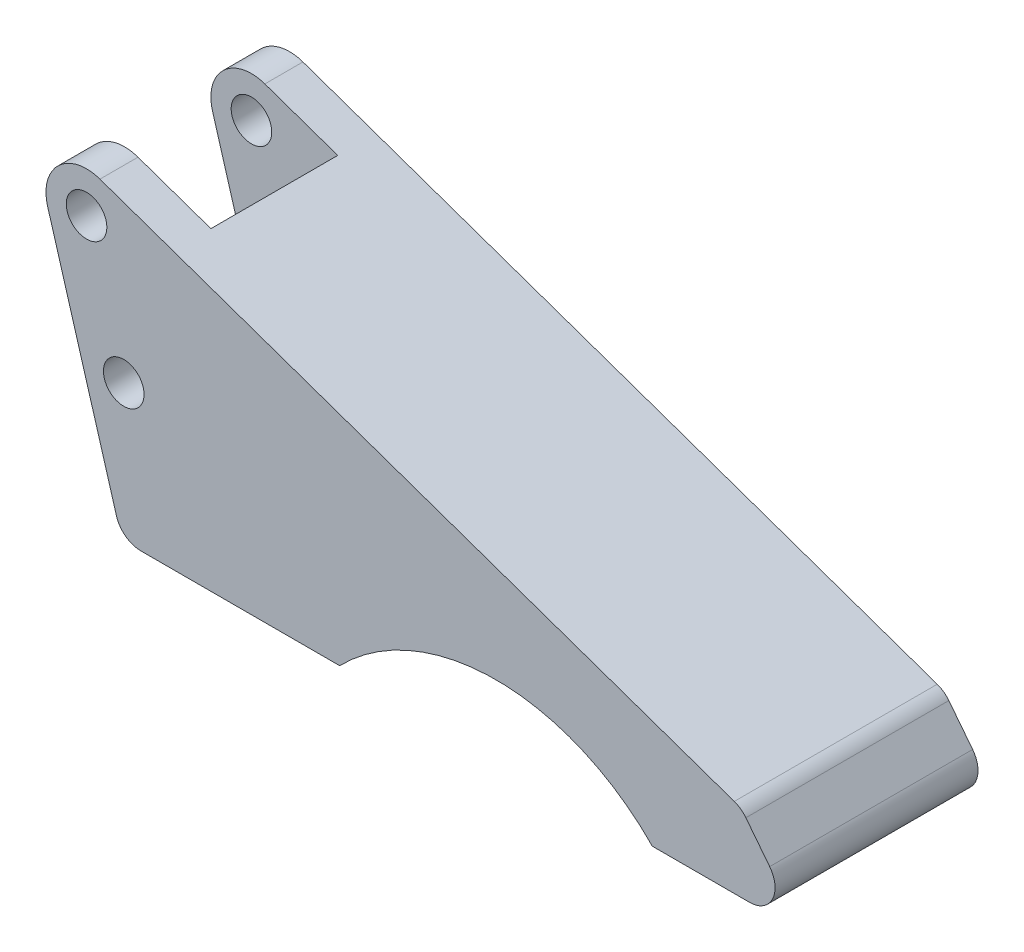
ISO-10303-21;
HEADER;
FILE_DESCRIPTION(('STEP AP214'),'2;1');
FILE_NAME('part.step','',(''),(''),'','','');
FILE_SCHEMA(('AUTOMOTIVE_DESIGN { 1 0 10303 214 1 1 1 1 }'));
ENDSEC;
DATA;
#1=APPLICATION_CONTEXT('core data for automotive mechanical design processes');
#2=APPLICATION_PROTOCOL_DEFINITION('international standard','automotive_design',2000,#1);
#3=PRODUCT_CONTEXT('',#1,'mechanical');
#4=PRODUCT('Part','Part','',(#3));
#5=PRODUCT_RELATED_PRODUCT_CATEGORY('part','',(#4));
#6=PRODUCT_DEFINITION_FORMATION('','',#4);
#7=PRODUCT_DEFINITION_CONTEXT('part definition',#1,'design');
#8=PRODUCT_DEFINITION('design','',#6,#7);
#9=PRODUCT_DEFINITION_SHAPE('','',#8);
#10=(LENGTH_UNIT() NAMED_UNIT(*) SI_UNIT(.MILLI.,.METRE.));
#11=(NAMED_UNIT(*) PLANE_ANGLE_UNIT() SI_UNIT($,.RADIAN.));
#12=(NAMED_UNIT(*) SI_UNIT($,.STERADIAN.) SOLID_ANGLE_UNIT());
#13=UNCERTAINTY_MEASURE_WITH_UNIT(LENGTH_MEASURE(1.E-05),#10,'distance_accuracy_value','');
#14=(GEOMETRIC_REPRESENTATION_CONTEXT(3) GLOBAL_UNCERTAINTY_ASSIGNED_CONTEXT((#13)) GLOBAL_UNIT_ASSIGNED_CONTEXT((#10,
#11,#12)) REPRESENTATION_CONTEXT('',''));
#15=CARTESIAN_POINT('',(0.,0.,0.));
#16=DIRECTION('',(0.,0.,1.));
#17=DIRECTION('',(1.,0.,0.));
#18=AXIS2_PLACEMENT_3D('',#15,#16,#17);
#19=CARTESIAN_POINT('',(0.,0.,20.));
#20=DIRECTION('',(0.,0.,-1.));
#21=DIRECTION('',(-1.,0.,0.));
#22=AXIS2_PLACEMENT_3D('',#19,#20,#21);
#23=CYLINDRICAL_SURFACE('',#22,5.);
#24=DIRECTION('',(0.,0.,-1.));
#25=VECTOR('',#24,1.);
#26=CARTESIAN_POINT('',(0.,-5.,20.));
#27=LINE('',#26,#25);
#28=CARTESIAN_POINT('',(0.,-5.,-12.5));
#29=VERTEX_POINT('',#28);
#30=CARTESIAN_POINT('',(0.,-5.,-20.));
#31=VERTEX_POINT('',#30);
#32=EDGE_CURVE('E211',#29,#31,#27,.T.);
#33=ORIENTED_EDGE('',*,*,#32,.F.);
#34=CARTESIAN_POINT('',(0.,0.,-12.5));
#35=DIRECTION('',(0.,0.,-1.));
#36=DIRECTION('',(-1.,0.,0.));
#37=AXIS2_PLACEMENT_3D('',#34,#35,#36);
#38=CIRCLE('',#37,5.);
#39=CARTESIAN_POINT('',(-4.79593025749352,-1.4138786953831,-12.5));
#40=VERTEX_POINT('',#39);
#41=EDGE_CURVE('E232',#29,#40,#38,.T.);
#42=ORIENTED_EDGE('',*,*,#41,.T.);
#43=DIRECTION('',(0.,0.,-1.));
#44=VECTOR('',#43,1.);
#45=CARTESIAN_POINT('',(-4.79593025749352,-1.4138786953831,20.));
#46=LINE('',#45,#44);
#47=CARTESIAN_POINT('',(-4.79593025749352,-1.4138786953831,-20.));
#48=VERTEX_POINT('',#47);
#49=EDGE_CURVE('E103',#40,#48,#46,.T.);
#50=ORIENTED_EDGE('',*,*,#49,.T.);
#51=CARTESIAN_POINT('',(0.,0.,-20.));
#52=DIRECTION('',(0.,0.,1.));
#53=DIRECTION('',(1.,0.,0.));
#54=AXIS2_PLACEMENT_3D('',#51,#52,#53);
#55=CIRCLE('',#54,5.);
#56=EDGE_CURVE('E166',#48,#31,#55,.T.);
#57=ORIENTED_EDGE('',*,*,#56,.T.);
#58=EDGE_LOOP('',(#33,#42,#50,#57));
#59=FACE_BOUND('',#58,.T.);
#60=ADVANCED_FACE('F39',(#59),#23,.T.);
#61=CARTESIAN_POINT('',(-10.69,46.87,20.));
#62=DIRECTION('',(0.,0.,-1.));
#63=DIRECTION('',(-1.,0.,0.));
#64=AXIS2_PLACEMENT_3D('',#61,#62,#63);
#65=CYLINDRICAL_SURFACE('',#64,8.);
#66=DIRECTION('',(0.,0.,-1.));
#67=VECTOR('',#66,1.);
#68=CARTESIAN_POINT('',(-18.3634884119896,44.607794087387,20.));
#69=LINE('',#68,#67);
#70=CARTESIAN_POINT('',(-18.3634884119896,44.607794087387,-12.5));
#71=VERTEX_POINT('',#70);
#72=CARTESIAN_POINT('',(-18.3634884119896,44.607794087387,-20.));
#73=VERTEX_POINT('',#72);
#74=EDGE_CURVE('E193',#71,#73,#69,.T.);
#75=ORIENTED_EDGE('',*,*,#74,.F.);
#76=CARTESIAN_POINT('',(-10.69,46.87,-12.5));
#77=DIRECTION('',(0.,0.,-1.));
#78=DIRECTION('',(-1.,0.,0.));
#79=AXIS2_PLACEMENT_3D('',#76,#77,#78);
#80=CIRCLE('',#79,8.);
#81=CARTESIAN_POINT('',(-8.05,54.4218474560865,-12.5));
#82=VERTEX_POINT('',#81);
#83=EDGE_CURVE('E233',#71,#82,#80,.T.);
#84=ORIENTED_EDGE('',*,*,#83,.T.);
#85=DIRECTION('',(0.,0.,-1.));
#86=VECTOR('',#85,1.);
#87=CARTESIAN_POINT('',(-8.05,54.4218474560865,20.));
#88=LINE('',#87,#86);
#89=CARTESIAN_POINT('',(-8.05,54.4218474560865,-20.));
#90=VERTEX_POINT('',#89);
#91=EDGE_CURVE('E157',#82,#90,#88,.T.);
#92=ORIENTED_EDGE('',*,*,#91,.T.);
#93=CARTESIAN_POINT('',(-10.69,46.87,-20.));
#94=DIRECTION('',(0.,0.,1.));
#95=DIRECTION('',(1.,0.,0.));
#96=AXIS2_PLACEMENT_3D('',#93,#94,#95);
#97=CIRCLE('',#96,8.);
#98=EDGE_CURVE('E184',#90,#73,#97,.T.);
#99=ORIENTED_EDGE('',*,*,#98,.T.);
#100=EDGE_LOOP('',(#75,#84,#92,#99));
#101=FACE_BOUND('',#100,.T.);
#102=ADVANCED_FACE('F279',(#101),#65,.T.);
#103=CARTESIAN_POINT('',(-18.3634884119896,44.607794087387,20.));
#104=DIRECTION('',(0.959186051498703,0.282775739076619,0.));
#105=DIRECTION('',(-0.282775739076619,0.959186051498703,0.));
#106=AXIS2_PLACEMENT_3D('',#103,#104,#105);
#107=PLANE('',#106);
#108=ORIENTED_EDGE('',*,*,#49,.F.);
#109=DIRECTION('',(-0.282775739076619,0.959186051498703,0.));
#110=VECTOR('',#109,1.);
#111=CARTESIAN_POINT('',(-18.3634884119896,44.607794087387,-12.5));
#112=LINE('',#111,#110);
#113=EDGE_CURVE('E223',#40,#71,#112,.T.);
#114=ORIENTED_EDGE('',*,*,#113,.T.);
#115=ORIENTED_EDGE('',*,*,#74,.T.);
#116=DIRECTION('',(0.282775739076619,-0.959186051498703,0.));
#117=VECTOR('',#116,1.);
#118=CARTESIAN_POINT('',(-18.3634884119896,44.607794087387,-20.));
#119=LINE('',#118,#117);
#120=EDGE_CURVE('E187',#73,#48,#119,.T.);
#121=ORIENTED_EDGE('',*,*,#120,.T.);
#122=EDGE_LOOP('',(#108,#114,#115,#121));
#123=FACE_BOUND('',#122,.T.);
#124=ADVANCED_FACE('F339',(#123),#107,.F.);
#125=CARTESIAN_POINT('',(-3.36,22.,20.));
#126=DIRECTION('',(0.,0.,-1.));
#127=DIRECTION('',(-1.,0.,0.));
#128=AXIS2_PLACEMENT_3D('',#125,#126,#127);
#129=CYLINDRICAL_SURFACE('',#128,4.);
#130=CARTESIAN_POINT('',(-3.36,22.,-12.5));
#131=DIRECTION('',(0.,0.,-1.));
#132=DIRECTION('',(-1.,0.,0.));
#133=AXIS2_PLACEMENT_3D('',#130,#131,#132);
#134=CIRCLE('',#133,4.);
#135=CARTESIAN_POINT('',(-7.36000000000001,22.,-12.5));
#136=VERTEX_POINT('',#135);
#137=EDGE_CURVE('E219',#136,#136,#134,.T.);
#138=ORIENTED_EDGE('',*,*,#137,.F.);
#139=EDGE_LOOP('',(#138));
#140=FACE_BOUND('',#139,.T.);
#141=CARTESIAN_POINT('',(-3.36,22.,-20.));
#142=DIRECTION('',(0.,0.,1.));
#143=DIRECTION('',(1.,0.,0.));
#144=AXIS2_PLACEMENT_3D('',#141,#142,#143);
#145=CIRCLE('',#144,4.);
#146=CARTESIAN_POINT('',(0.639999999999999,22.,-20.));
#147=VERTEX_POINT('',#146);
#148=EDGE_CURVE('E244',#147,#147,#145,.T.);
#149=ORIENTED_EDGE('',*,*,#148,.F.);
#150=EDGE_LOOP('',(#149));
#151=FACE_BOUND('',#150,.T.);
#152=ADVANCED_FACE('F347',(#140,#151),#129,.F.);
#153=CARTESIAN_POINT('',(-10.69,46.87,20.));
#154=DIRECTION('',(0.,0.,-1.));
#155=DIRECTION('',(-1.,0.,0.));
#156=AXIS2_PLACEMENT_3D('',#153,#154,#155);
#157=CYLINDRICAL_SURFACE('',#156,4.);
#158=CARTESIAN_POINT('',(-10.69,46.87,-12.5));
#159=DIRECTION('',(0.,0.,-1.));
#160=DIRECTION('',(-1.,0.,0.));
#161=AXIS2_PLACEMENT_3D('',#158,#159,#160);
#162=CIRCLE('',#161,4.);
#163=CARTESIAN_POINT('',(-14.69,46.87,-12.5));
#164=VERTEX_POINT('',#163);
#165=EDGE_CURVE('E217',#164,#164,#162,.T.);
#166=ORIENTED_EDGE('',*,*,#165,.F.);
#167=EDGE_LOOP('',(#166));
#168=FACE_BOUND('',#167,.T.);
#169=CARTESIAN_POINT('',(-10.69,46.87,-20.));
#170=DIRECTION('',(0.,0.,1.));
#171=DIRECTION('',(1.,0.,0.));
#172=AXIS2_PLACEMENT_3D('',#169,#170,#171);
#173=CIRCLE('',#172,4.);
#174=CARTESIAN_POINT('',(-6.69,46.87,-20.));
#175=VERTEX_POINT('',#174);
#176=EDGE_CURVE('E240',#175,#175,#173,.T.);
#177=ORIENTED_EDGE('',*,*,#176,.F.);
#178=EDGE_LOOP('',(#177));
#179=FACE_BOUND('',#178,.T.);
#180=ADVANCED_FACE('F369',(#168,#179),#157,.F.);
#181=CARTESIAN_POINT('',(0.,0.,20.));
#182=DIRECTION('',(0.,0.,1.));
#183=DIRECTION('',(1.,0.,0.));
#184=AXIS2_PLACEMENT_3D('',#181,#182,#183);
#185=PLANE('',#184);
#186=CARTESIAN_POINT('',(-3.36,22.,20.));
#187=DIRECTION('',(0.,0.,1.));
#188=DIRECTION('',(1.,0.,0.));
#189=AXIS2_PLACEMENT_3D('',#186,#187,#188);
#190=CIRCLE('',#189,4.);
#191=CARTESIAN_POINT('',(0.639999999999999,22.,20.));
#192=VERTEX_POINT('',#191);
#193=EDGE_CURVE('E169',#192,#192,#190,.T.);
#194=ORIENTED_EDGE('',*,*,#193,.F.);
#195=EDGE_LOOP('',(#194));
#196=FACE_BOUND('',#195,.T.);
#197=CARTESIAN_POINT('',(0.,0.,20.));
#198=DIRECTION('',(0.,0.,1.));
#199=DIRECTION('',(1.,0.,0.));
#200=AXIS2_PLACEMENT_3D('',#197,#198,#199);
#201=CIRCLE('',#200,5.);
#202=CARTESIAN_POINT('',(-4.79593025749352,-1.4138786953831,20.));
#203=VERTEX_POINT('',#202);
#204=CARTESIAN_POINT('',(0.,-5.,20.));
#205=VERTEX_POINT('',#204);
#206=EDGE_CURVE('E189',#203,#205,#201,.T.);
#207=ORIENTED_EDGE('',*,*,#206,.T.);
#208=DIRECTION('',(1.,0.,0.));
#209=VECTOR('',#208,1.);
#210=CARTESIAN_POINT('',(0.,-5.,20.));
#211=LINE('',#210,#209);
#212=CARTESIAN_POINT('',(39.1941563985013,-5.,20.));
#213=VERTEX_POINT('',#212);
#214=EDGE_CURVE('E112',#205,#213,#211,.T.);
#215=ORIENTED_EDGE('',*,*,#214,.T.);
#216=CARTESIAN_POINT('',(70.,-35.,20.));
#217=DIRECTION('',(0.,0.,-1.));
#218=DIRECTION('',(-1.,0.,0.));
#219=AXIS2_PLACEMENT_3D('',#216,#217,#218);
#220=CIRCLE('',#219,43.);
#221=CARTESIAN_POINT('',(100.805843601499,-5.,20.));
#222=VERTEX_POINT('',#221);
#223=EDGE_CURVE('E253',#213,#222,#220,.T.);
#224=ORIENTED_EDGE('',*,*,#223,.T.);
#225=DIRECTION('',(1.,0.,0.));
#226=VECTOR('',#225,1.);
#227=CARTESIAN_POINT('',(100.805843601499,-5.,20.));
#228=LINE('',#227,#226);
#229=CARTESIAN_POINT('',(120.,-5.,20.));
#230=VERTEX_POINT('',#229);
#231=EDGE_CURVE('E255',#222,#230,#228,.T.);
#232=ORIENTED_EDGE('',*,*,#231,.T.);
#233=CARTESIAN_POINT('',(120.,0.,20.));
#234=DIRECTION('',(0.,0.,1.));
#235=DIRECTION('',(1.,0.,0.));
#236=AXIS2_PLACEMENT_3D('',#233,#234,#235);
#237=CIRCLE('',#236,5.);
#238=CARTESIAN_POINT('',(123.9398087808,3.07862092027062,20.));
#239=VERTEX_POINT('',#238);
#240=EDGE_CURVE('E257',#230,#239,#237,.T.);
#241=ORIENTED_EDGE('',*,*,#240,.T.);
#242=DIRECTION('',(-0.615724184054123,0.787961756160085,0.));
#243=VECTOR('',#242,1.);
#244=CARTESIAN_POINT('',(123.9398087808,3.07862092027062,20.));
#245=LINE('',#244,#243);
#246=CARTESIAN_POINT('',(119.251326027109,9.07862092027068,20.));
#247=VERTEX_POINT('',#246);
#248=EDGE_CURVE('E259',#239,#247,#245,.T.);
#249=ORIENTED_EDGE('',*,*,#248,.T.);
#250=CARTESIAN_POINT('',(115.311517246309,6.,20.));
#251=DIRECTION('',(0.,0.,1.));
#252=DIRECTION('',(1.,0.,0.));
#253=AXIS2_PLACEMENT_3D('',#250,#251,#252);
#254=CIRCLE('',#253,5.00000000000003);
#255=CARTESIAN_POINT('',(116.961517246309,10.719904660054,20.));
#256=VERTEX_POINT('',#255);
#257=EDGE_CURVE('E141',#247,#256,#254,.T.);
#258=ORIENTED_EDGE('',*,*,#257,.T.);
#259=DIRECTION('',(-0.943980932010811,0.33,0.));
#260=VECTOR('',#259,1.);
#261=CARTESIAN_POINT('',(116.961517246309,10.719904660054,20.));
#262=LINE('',#261,#260);
#263=CARTESIAN_POINT('',(-8.05,54.4218474560865,20.));
#264=VERTEX_POINT('',#263);
#265=EDGE_CURVE('E133',#256,#264,#262,.T.);
#266=ORIENTED_EDGE('',*,*,#265,.T.);
#267=CARTESIAN_POINT('',(-10.69,46.87,20.));
#268=DIRECTION('',(0.,0.,1.));
#269=DIRECTION('',(1.,0.,0.));
#270=AXIS2_PLACEMENT_3D('',#267,#268,#269);
#271=CIRCLE('',#270,8.);
#272=CARTESIAN_POINT('',(-18.3634884119896,44.607794087387,20.));
#273=VERTEX_POINT('',#272);
#274=EDGE_CURVE('E138',#264,#273,#271,.T.);
#275=ORIENTED_EDGE('',*,*,#274,.T.);
#276=DIRECTION('',(0.282775739076619,-0.959186051498703,0.));
#277=VECTOR('',#276,1.);
#278=CARTESIAN_POINT('',(-18.3634884119896,44.607794087387,20.));
#279=LINE('',#278,#277);
#280=EDGE_CURVE('E63',#273,#203,#279,.T.);
#281=ORIENTED_EDGE('',*,*,#280,.T.);
#282=EDGE_LOOP('',(#207,#215,#224,#232,#241,#249,#258,#266,#275,#281));
#283=FACE_BOUND('',#282,.T.);
#284=CARTESIAN_POINT('',(-10.69,46.87,20.));
#285=DIRECTION('',(0.,0.,1.));
#286=DIRECTION('',(1.,0.,0.));
#287=AXIS2_PLACEMENT_3D('',#284,#285,#286);
#288=CIRCLE('',#287,4.);
#289=CARTESIAN_POINT('',(-6.69,46.87,20.));
#290=VERTEX_POINT('',#289);
#291=EDGE_CURVE('E241',#290,#290,#288,.T.);
#292=ORIENTED_EDGE('',*,*,#291,.F.);
#293=EDGE_LOOP('',(#292));
#294=FACE_BOUND('',#293,.T.);
#295=ADVANCED_FACE('F135',(#196,#283,#294),#185,.T.);
#296=CARTESIAN_POINT('',(0.,0.,-20.));
#297=DIRECTION('',(0.,0.,1.));
#298=DIRECTION('',(1.,0.,0.));
#299=AXIS2_PLACEMENT_3D('',#296,#297,#298);
#300=PLANE('',#299);
#301=ORIENTED_EDGE('',*,*,#56,.F.);
#302=ORIENTED_EDGE('',*,*,#120,.F.);
#303=ORIENTED_EDGE('',*,*,#98,.F.);
#304=DIRECTION('',(-0.943980932010811,0.33,0.));
#305=VECTOR('',#304,1.);
#306=CARTESIAN_POINT('',(116.961517246309,10.719904660054,-20.));
#307=LINE('',#306,#305);
#308=CARTESIAN_POINT('',(116.961517246309,10.719904660054,-20.));
#309=VERTEX_POINT('',#308);
#310=EDGE_CURVE('E181',#309,#90,#307,.T.);
#311=ORIENTED_EDGE('',*,*,#310,.F.);
#312=CARTESIAN_POINT('',(115.311517246309,6.,-20.));
#313=DIRECTION('',(0.,0.,1.));
#314=DIRECTION('',(1.,0.,0.));
#315=AXIS2_PLACEMENT_3D('',#312,#313,#314);
#316=CIRCLE('',#315,5.00000000000003);
#317=CARTESIAN_POINT('',(119.251326027109,9.07862092027068,-20.));
#318=VERTEX_POINT('',#317);
#319=EDGE_CURVE('E179',#318,#309,#316,.T.);
#320=ORIENTED_EDGE('',*,*,#319,.F.);
#321=DIRECTION('',(-0.615724184054123,0.787961756160085,0.));
#322=VECTOR('',#321,1.);
#323=CARTESIAN_POINT('',(123.9398087808,3.07862092027062,-20.));
#324=LINE('',#323,#322);
#325=CARTESIAN_POINT('',(123.9398087808,3.07862092027062,-20.));
#326=VERTEX_POINT('',#325);
#327=EDGE_CURVE('E177',#326,#318,#324,.T.);
#328=ORIENTED_EDGE('',*,*,#327,.F.);
#329=CARTESIAN_POINT('',(120.,0.,-20.));
#330=DIRECTION('',(0.,0.,1.));
#331=DIRECTION('',(1.,0.,0.));
#332=AXIS2_PLACEMENT_3D('',#329,#330,#331);
#333=CIRCLE('',#332,5.);
#334=CARTESIAN_POINT('',(120.,-5.,-20.));
#335=VERTEX_POINT('',#334);
#336=EDGE_CURVE('E175',#335,#326,#333,.T.);
#337=ORIENTED_EDGE('',*,*,#336,.F.);
#338=DIRECTION('',(1.,0.,0.));
#339=VECTOR('',#338,1.);
#340=CARTESIAN_POINT('',(100.805843601499,-5.,-20.));
#341=LINE('',#340,#339);
#342=CARTESIAN_POINT('',(100.805843601499,-5.,-20.));
#343=VERTEX_POINT('',#342);
#344=EDGE_CURVE('E173',#343,#335,#341,.T.);
#345=ORIENTED_EDGE('',*,*,#344,.F.);
#346=CARTESIAN_POINT('',(70.,-35.,-20.));
#347=DIRECTION('',(0.,0.,-1.));
#348=DIRECTION('',(-1.,0.,0.));
#349=AXIS2_PLACEMENT_3D('',#346,#347,#348);
#350=CIRCLE('',#349,43.);
#351=CARTESIAN_POINT('',(39.1941563985013,-5.,-20.));
#352=VERTEX_POINT('',#351);
#353=EDGE_CURVE('E171',#352,#343,#350,.T.);
#354=ORIENTED_EDGE('',*,*,#353,.F.);
#355=DIRECTION('',(1.,0.,0.));
#356=VECTOR('',#355,1.);
#357=CARTESIAN_POINT('',(0.,-5.,-20.));
#358=LINE('',#357,#356);
#359=EDGE_CURVE('E168',#31,#352,#358,.T.);
#360=ORIENTED_EDGE('',*,*,#359,.F.);
#361=EDGE_LOOP('',(#301,#302,#303,#311,#320,#328,#337,#345,#354,#360));
#362=FACE_BOUND('',#361,.T.);
#363=ORIENTED_EDGE('',*,*,#148,.T.);
#364=EDGE_LOOP('',(#363));
#365=FACE_BOUND('',#364,.T.);
#366=ORIENTED_EDGE('',*,*,#176,.T.);
#367=EDGE_LOOP('',(#366));
#368=FACE_BOUND('',#367,.T.);
#369=ADVANCED_FACE('F274',(#362,#365,#368),#300,.F.);
#370=CARTESIAN_POINT('',(-4.79593025749352,-1.4138786953831,12.5));
#371=VERTEX_POINT('',#370);
#372=EDGE_CURVE('E190',#203,#371,#46,.T.);
#373=ORIENTED_EDGE('',*,*,#372,.T.);
#374=CARTESIAN_POINT('',(0.,0.,12.5));
#375=DIRECTION('',(0.,0.,1.));
#376=DIRECTION('',(1.,0.,0.));
#377=AXIS2_PLACEMENT_3D('',#374,#375,#376);
#378=CIRCLE('',#377,5.);
#379=CARTESIAN_POINT('',(0.,-5.,12.5));
#380=VERTEX_POINT('',#379);
#381=EDGE_CURVE('E54',#371,#380,#378,.T.);
#382=ORIENTED_EDGE('',*,*,#381,.T.);
#383=EDGE_CURVE('E47',#205,#380,#27,.T.);
#384=ORIENTED_EDGE('',*,*,#383,.F.);
#385=ORIENTED_EDGE('',*,*,#206,.F.);
#386=EDGE_LOOP('',(#373,#382,#384,#385));
#387=FACE_BOUND('',#386,.T.);
#388=ADVANCED_FACE('F41',(#387),#23,.T.);
#389=CARTESIAN_POINT('',(0.,-5.,20.));
#390=DIRECTION('',(0.,1.,0.));
#391=DIRECTION('',(0.,0.,1.));
#392=AXIS2_PLACEMENT_3D('',#389,#390,#391);
#393=PLANE('',#392);
#394=DIRECTION('',(0.,0.,-1.));
#395=VECTOR('',#394,1.);
#396=CARTESIAN_POINT('',(6.30999999999999,-5.,12.5));
#397=LINE('',#396,#395);
#398=CARTESIAN_POINT('',(6.30999999999999,-5.,12.5));
#399=VERTEX_POINT('',#398);
#400=CARTESIAN_POINT('',(6.30999999999999,-5.,-12.5));
#401=VERTEX_POINT('',#400);
#402=EDGE_CURVE('E318',#399,#401,#397,.T.);
#403=ORIENTED_EDGE('',*,*,#402,.T.);
#404=DIRECTION('',(-1.,0.,0.));
#405=VECTOR('',#404,1.);
#406=CARTESIAN_POINT('',(6.30999999999999,-5.,-12.5));
#407=LINE('',#406,#405);
#408=EDGE_CURVE('E315',#401,#29,#407,.T.);
#409=ORIENTED_EDGE('',*,*,#408,.T.);
#410=ORIENTED_EDGE('',*,*,#32,.T.);
#411=ORIENTED_EDGE('',*,*,#359,.T.);
#412=DIRECTION('',(0.,0.,-1.));
#413=VECTOR('',#412,1.);
#414=CARTESIAN_POINT('',(39.1941563985013,-5.,20.));
#415=LINE('',#414,#413);
#416=EDGE_CURVE('E208',#213,#352,#415,.T.);
#417=ORIENTED_EDGE('',*,*,#416,.F.);
#418=ORIENTED_EDGE('',*,*,#214,.F.);
#419=ORIENTED_EDGE('',*,*,#383,.T.);
#420=DIRECTION('',(1.,0.,0.));
#421=VECTOR('',#420,1.);
#422=CARTESIAN_POINT('',(6.30999999999999,-5.,12.5));
#423=LINE('',#422,#421);
#424=EDGE_CURVE('E313',#380,#399,#423,.T.);
#425=ORIENTED_EDGE('',*,*,#424,.T.);
#426=EDGE_LOOP('',(#403,#409,#410,#411,#417,#418,#419,#425));
#427=FACE_BOUND('',#426,.T.);
#428=ADVANCED_FACE('F323',(#427),#393,.F.);
#429=CARTESIAN_POINT('',(70.,-35.,20.));
#430=DIRECTION('',(0.,0.,-1.));
#431=DIRECTION('',(-1.,0.,0.));
#432=AXIS2_PLACEMENT_3D('',#429,#430,#431);
#433=CYLINDRICAL_SURFACE('',#432,43.);
#434=ORIENTED_EDGE('',*,*,#353,.T.);
#435=DIRECTION('',(0.,0.,-1.));
#436=VECTOR('',#435,1.);
#437=CARTESIAN_POINT('',(100.805843601499,-5.,20.));
#438=LINE('',#437,#436);
#439=EDGE_CURVE('E205',#222,#343,#438,.T.);
#440=ORIENTED_EDGE('',*,*,#439,.F.);
#441=ORIENTED_EDGE('',*,*,#223,.F.);
#442=ORIENTED_EDGE('',*,*,#416,.T.);
#443=EDGE_LOOP('',(#434,#440,#441,#442));
#444=FACE_BOUND('',#443,.T.);
#445=ADVANCED_FACE('F363',(#444),#433,.F.);
#446=CARTESIAN_POINT('',(100.805843601499,-5.,20.));
#447=DIRECTION('',(0.,1.,0.));
#448=DIRECTION('',(0.,0.,1.));
#449=AXIS2_PLACEMENT_3D('',#446,#447,#448);
#450=PLANE('',#449);
#451=ORIENTED_EDGE('',*,*,#344,.T.);
#452=DIRECTION('',(0.,0.,-1.));
#453=VECTOR('',#452,1.);
#454=CARTESIAN_POINT('',(120.,-5.,20.));
#455=LINE('',#454,#453);
#456=EDGE_CURVE('E202',#230,#335,#455,.T.);
#457=ORIENTED_EDGE('',*,*,#456,.F.);
#458=ORIENTED_EDGE('',*,*,#231,.F.);
#459=ORIENTED_EDGE('',*,*,#439,.T.);
#460=EDGE_LOOP('',(#451,#457,#458,#459));
#461=FACE_BOUND('',#460,.T.);
#462=ADVANCED_FACE('F460',(#461),#450,.F.);
#463=CARTESIAN_POINT('',(120.,0.,20.));
#464=DIRECTION('',(0.,0.,-1.));
#465=DIRECTION('',(-1.,0.,0.));
#466=AXIS2_PLACEMENT_3D('',#463,#464,#465);
#467=CYLINDRICAL_SURFACE('',#466,5.);
#468=ORIENTED_EDGE('',*,*,#336,.T.);
#469=DIRECTION('',(0.,0.,-1.));
#470=VECTOR('',#469,1.);
#471=CARTESIAN_POINT('',(123.9398087808,3.07862092027062,20.));
#472=LINE('',#471,#470);
#473=EDGE_CURVE('E199',#239,#326,#472,.T.);
#474=ORIENTED_EDGE('',*,*,#473,.F.);
#475=ORIENTED_EDGE('',*,*,#240,.F.);
#476=ORIENTED_EDGE('',*,*,#456,.T.);
#477=EDGE_LOOP('',(#468,#474,#475,#476));
#478=FACE_BOUND('',#477,.T.);
#479=ADVANCED_FACE('F453',(#478),#467,.T.);
#480=CARTESIAN_POINT('',(123.9398087808,3.07862092027062,20.));
#481=DIRECTION('',(-0.787961756160085,-0.615724184054123,0.));
#482=DIRECTION('',(0.615724184054123,-0.787961756160085,0.));
#483=AXIS2_PLACEMENT_3D('',#480,#481,#482);
#484=PLANE('',#483);
#485=ORIENTED_EDGE('',*,*,#327,.T.);
#486=DIRECTION('',(0.,0.,-1.));
#487=VECTOR('',#486,1.);
#488=CARTESIAN_POINT('',(119.251326027109,9.07862092027068,20.));
#489=LINE('',#488,#487);
#490=EDGE_CURVE('E196',#247,#318,#489,.T.);
#491=ORIENTED_EDGE('',*,*,#490,.F.);
#492=ORIENTED_EDGE('',*,*,#248,.F.);
#493=ORIENTED_EDGE('',*,*,#473,.T.);
#494=EDGE_LOOP('',(#485,#491,#492,#493));
#495=FACE_BOUND('',#494,.T.);
#496=ADVANCED_FACE('F265',(#495),#484,.F.);
#497=CARTESIAN_POINT('',(115.311517246309,6.,20.));
#498=DIRECTION('',(0.,0.,-1.));
#499=DIRECTION('',(-1.,0.,0.));
#500=AXIS2_PLACEMENT_3D('',#497,#498,#499);
#501=CYLINDRICAL_SURFACE('',#500,5.00000000000003);
#502=ORIENTED_EDGE('',*,*,#319,.T.);
#503=DIRECTION('',(0.,0.,-1.));
#504=VECTOR('',#503,1.);
#505=CARTESIAN_POINT('',(116.961517246309,10.719904660054,20.));
#506=LINE('',#505,#504);
#507=EDGE_CURVE('E156',#256,#309,#506,.T.);
#508=ORIENTED_EDGE('',*,*,#507,.F.);
#509=ORIENTED_EDGE('',*,*,#257,.F.);
#510=ORIENTED_EDGE('',*,*,#490,.T.);
#511=EDGE_LOOP('',(#502,#508,#509,#510));
#512=FACE_BOUND('',#511,.T.);
#513=ADVANCED_FACE('F269',(#512),#501,.T.);
#514=CARTESIAN_POINT('',(116.961517246309,10.719904660054,20.));
#515=DIRECTION('',(-0.33,-0.943980932010811,0.));
#516=DIRECTION('',(0.943980932010811,-0.33,0.));
#517=AXIS2_PLACEMENT_3D('',#514,#515,#516);
#518=PLANE('',#517);
#519=ORIENTED_EDGE('',*,*,#91,.F.);
#520=DIRECTION('',(0.943980932010811,-0.33,0.));
#521=VECTOR('',#520,1.);
#522=CARTESIAN_POINT('',(116.961517246309,10.719904660054,-12.5));
#523=LINE('',#522,#521);
#524=CARTESIAN_POINT('',(6.30999999999999,49.4018308018245,-12.5));
#525=VERTEX_POINT('',#524);
#526=EDGE_CURVE('E236',#82,#525,#523,.T.);
#527=ORIENTED_EDGE('',*,*,#526,.T.);
#528=DIRECTION('',(0.,0.,1.));
#529=VECTOR('',#528,1.);
#530=CARTESIAN_POINT('',(6.31,49.4018308018245,20.));
#531=LINE('',#530,#529);
#532=CARTESIAN_POINT('',(6.30999999999999,49.4018308018245,12.5));
#533=VERTEX_POINT('',#532);
#534=EDGE_CURVE('E11',#525,#533,#531,.T.);
#535=ORIENTED_EDGE('',*,*,#534,.T.);
#536=DIRECTION('',(-0.943980932010811,0.33,0.));
#537=VECTOR('',#536,1.);
#538=CARTESIAN_POINT('',(116.961517246309,10.719904660054,12.5));
#539=LINE('',#538,#537);
#540=CARTESIAN_POINT('',(-8.05,54.4218474560865,12.5));
#541=VERTEX_POINT('',#540);
#542=EDGE_CURVE('E153',#533,#541,#539,.T.);
#543=ORIENTED_EDGE('',*,*,#542,.T.);
#544=EDGE_CURVE('E148',#264,#541,#88,.T.);
#545=ORIENTED_EDGE('',*,*,#544,.F.);
#546=ORIENTED_EDGE('',*,*,#265,.F.);
#547=ORIENTED_EDGE('',*,*,#507,.T.);
#548=ORIENTED_EDGE('',*,*,#310,.T.);
#549=EDGE_LOOP('',(#519,#527,#535,#543,#545,#546,#547,#548));
#550=FACE_BOUND('',#549,.T.);
#551=ADVANCED_FACE('F150',(#550),#518,.F.);
#552=CARTESIAN_POINT('',(-10.69,46.87,12.5));
#553=DIRECTION('',(0.,0.,1.));
#554=DIRECTION('',(1.,0.,0.));
#555=AXIS2_PLACEMENT_3D('',#552,#553,#554);
#556=CIRCLE('',#555,8.);
#557=CARTESIAN_POINT('',(-18.3634884119896,44.607794087387,12.5));
#558=VERTEX_POINT('',#557);
#559=EDGE_CURVE('E225',#541,#558,#556,.T.);
#560=ORIENTED_EDGE('',*,*,#559,.T.);
#561=EDGE_CURVE('E161',#273,#558,#69,.T.);
#562=ORIENTED_EDGE('',*,*,#561,.F.);
#563=ORIENTED_EDGE('',*,*,#274,.F.);
#564=ORIENTED_EDGE('',*,*,#544,.T.);
#565=EDGE_LOOP('',(#560,#562,#563,#564));
#566=FACE_BOUND('',#565,.T.);
#567=ADVANCED_FACE('F159',(#566),#65,.T.);
#568=ORIENTED_EDGE('',*,*,#561,.T.);
#569=DIRECTION('',(0.282775739076619,-0.959186051498703,0.));
#570=VECTOR('',#569,1.);
#571=CARTESIAN_POINT('',(-18.3634884119896,44.607794087387,12.5));
#572=LINE('',#571,#570);
#573=EDGE_CURVE('E331',#558,#371,#572,.T.);
#574=ORIENTED_EDGE('',*,*,#573,.T.);
#575=ORIENTED_EDGE('',*,*,#372,.F.);
#576=ORIENTED_EDGE('',*,*,#280,.F.);
#577=EDGE_LOOP('',(#568,#574,#575,#576));
#578=FACE_BOUND('',#577,.T.);
#579=ADVANCED_FACE('F335',(#578),#107,.F.);
#580=CARTESIAN_POINT('',(-3.36,22.,12.5));
#581=DIRECTION('',(0.,0.,1.));
#582=DIRECTION('',(1.,0.,0.));
#583=AXIS2_PLACEMENT_3D('',#580,#581,#582);
#584=CIRCLE('',#583,4.);
#585=CARTESIAN_POINT('',(0.639999999999999,22.,12.5));
#586=VERTEX_POINT('',#585);
#587=EDGE_CURVE('E215',#586,#586,#584,.T.);
#588=ORIENTED_EDGE('',*,*,#587,.F.);
#589=EDGE_LOOP('',(#588));
#590=FACE_BOUND('',#589,.T.);
#591=ORIENTED_EDGE('',*,*,#193,.T.);
#592=EDGE_LOOP('',(#591));
#593=FACE_BOUND('',#592,.T.);
#594=ADVANCED_FACE('F337',(#590,#593),#129,.F.);
#595=CARTESIAN_POINT('',(-10.69,46.87,12.5));
#596=DIRECTION('',(0.,0.,1.));
#597=DIRECTION('',(1.,0.,0.));
#598=AXIS2_PLACEMENT_3D('',#595,#596,#597);
#599=CIRCLE('',#598,4.);
#600=CARTESIAN_POINT('',(-6.69,46.87,12.5));
#601=VERTEX_POINT('',#600);
#602=EDGE_CURVE('E213',#601,#601,#599,.T.);
#603=ORIENTED_EDGE('',*,*,#602,.F.);
#604=EDGE_LOOP('',(#603));
#605=FACE_BOUND('',#604,.T.);
#606=ORIENTED_EDGE('',*,*,#291,.T.);
#607=EDGE_LOOP('',(#606));
#608=FACE_BOUND('',#607,.T.);
#609=ADVANCED_FACE('F344',(#605,#608),#157,.F.);
#610=CARTESIAN_POINT('',(6.30999999999999,-5.,12.5));
#611=DIRECTION('',(1.,0.,0.));
#612=DIRECTION('',(0.,0.,-1.));
#613=AXIS2_PLACEMENT_3D('',#610,#611,#612);
#614=PLANE('',#613);
#615=DIRECTION('',(0.,1.,0.));
#616=VECTOR('',#615,1.);
#617=CARTESIAN_POINT('',(6.30999999999999,-5.,-12.5));
#618=LINE('',#617,#616);
#619=EDGE_CURVE('E216',#401,#525,#618,.T.);
#620=ORIENTED_EDGE('',*,*,#619,.F.);
#621=ORIENTED_EDGE('',*,*,#402,.F.);
#622=DIRECTION('',(0.,1.,0.));
#623=VECTOR('',#622,1.);
#624=CARTESIAN_POINT('',(6.30999999999999,-5.,12.5));
#625=LINE('',#624,#623);
#626=EDGE_CURVE('E309',#399,#533,#625,.T.);
#627=ORIENTED_EDGE('',*,*,#626,.T.);
#628=ORIENTED_EDGE('',*,*,#534,.F.);
#629=EDGE_LOOP('',(#620,#621,#627,#628));
#630=FACE_BOUND('',#629,.T.);
#631=ADVANCED_FACE('F319',(#630),#614,.F.);
#632=CARTESIAN_POINT('',(6.30999999999999,-5.,-12.5));
#633=DIRECTION('',(0.,0.,-1.));
#634=DIRECTION('',(-1.,0.,0.));
#635=AXIS2_PLACEMENT_3D('',#632,#633,#634);
#636=PLANE('',#635);
#637=ORIENTED_EDGE('',*,*,#137,.T.);
#638=EDGE_LOOP('',(#637));
#639=FACE_BOUND('',#638,.T.);
#640=ORIENTED_EDGE('',*,*,#165,.T.);
#641=EDGE_LOOP('',(#640));
#642=FACE_BOUND('',#641,.T.);
#643=ORIENTED_EDGE('',*,*,#83,.F.);
#644=ORIENTED_EDGE('',*,*,#113,.F.);
#645=ORIENTED_EDGE('',*,*,#41,.F.);
#646=ORIENTED_EDGE('',*,*,#408,.F.);
#647=ORIENTED_EDGE('',*,*,#619,.T.);
#648=ORIENTED_EDGE('',*,*,#526,.F.);
#649=EDGE_LOOP('',(#643,#644,#645,#646,#647,#648));
#650=FACE_BOUND('',#649,.T.);
#651=ADVANCED_FACE('F378',(#639,#642,#650),#636,.F.);
#652=CARTESIAN_POINT('',(6.30999999999999,-5.,12.5));
#653=DIRECTION('',(0.,0.,1.));
#654=DIRECTION('',(1.,0.,0.));
#655=AXIS2_PLACEMENT_3D('',#652,#653,#654);
#656=PLANE('',#655);
#657=ORIENTED_EDGE('',*,*,#587,.T.);
#658=EDGE_LOOP('',(#657));
#659=FACE_BOUND('',#658,.T.);
#660=ORIENTED_EDGE('',*,*,#602,.T.);
#661=EDGE_LOOP('',(#660));
#662=FACE_BOUND('',#661,.T.);
#663=ORIENTED_EDGE('',*,*,#626,.F.);
#664=ORIENTED_EDGE('',*,*,#424,.F.);
#665=ORIENTED_EDGE('',*,*,#381,.F.);
#666=ORIENTED_EDGE('',*,*,#573,.F.);
#667=ORIENTED_EDGE('',*,*,#559,.F.);
#668=ORIENTED_EDGE('',*,*,#542,.F.);
#669=EDGE_LOOP('',(#663,#664,#665,#666,#667,#668));
#670=FACE_BOUND('',#669,.T.);
#671=ADVANCED_FACE('F311',(#659,#662,#670),#656,.F.);
#672=CLOSED_SHELL('',(#60,#102,#124,#152,#180,#295,#369,#388,#428,#445,#462,#479,#496,#513,#551,
#567,#579,#594,#609,#631,#651,#671));
#673=MANIFOLD_SOLID_BREP('B2',#672);
#674=ADVANCED_BREP_SHAPE_REPRESENTATION('',(#18,#673),#14);
#675=SHAPE_DEFINITION_REPRESENTATION(#9,#674);
ENDSEC;
END-ISO-10303-21;
